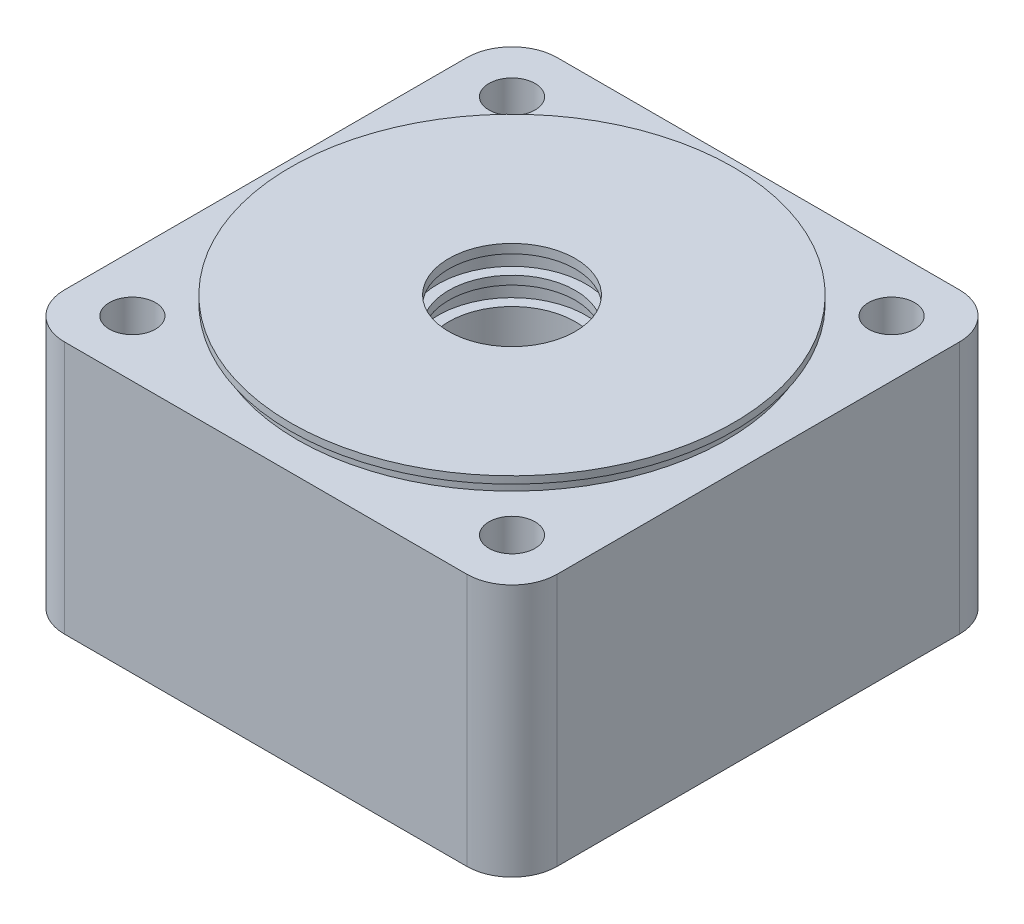
ISO-10303-21;
HEADER;
FILE_DESCRIPTION(('STEP AP214'),'2;1');
FILE_NAME('part.step','',(''),(''),'','','');
FILE_SCHEMA(('AUTOMOTIVE_DESIGN { 1 0 10303 214 1 1 1 1 }'));
ENDSEC;
DATA;
#1=APPLICATION_CONTEXT('core data for automotive mechanical design processes');
#2=APPLICATION_PROTOCOL_DEFINITION('international standard','automotive_design',2000,#1);
#3=PRODUCT_CONTEXT('',#1,'mechanical');
#4=PRODUCT('Part','Part','',(#3));
#5=PRODUCT_RELATED_PRODUCT_CATEGORY('part','',(#4));
#6=PRODUCT_DEFINITION_FORMATION('','',#4);
#7=PRODUCT_DEFINITION_CONTEXT('part definition',#1,'design');
#8=PRODUCT_DEFINITION('design','',#6,#7);
#9=PRODUCT_DEFINITION_SHAPE('','',#8);
#10=(LENGTH_UNIT() NAMED_UNIT(*) SI_UNIT(.MILLI.,.METRE.));
#11=(NAMED_UNIT(*) PLANE_ANGLE_UNIT() SI_UNIT($,.RADIAN.));
#12=(NAMED_UNIT(*) SI_UNIT($,.STERADIAN.) SOLID_ANGLE_UNIT());
#13=UNCERTAINTY_MEASURE_WITH_UNIT(LENGTH_MEASURE(1.E-05),#10,'distance_accuracy_value','');
#14=(GEOMETRIC_REPRESENTATION_CONTEXT(3) GLOBAL_UNCERTAINTY_ASSIGNED_CONTEXT((#13)) GLOBAL_UNIT_ASSIGNED_CONTEXT((#10,
#11,#12)) REPRESENTATION_CONTEXT('',''));
#15=CARTESIAN_POINT('',(0.,0.,0.));
#16=DIRECTION('',(0.,0.,1.));
#17=DIRECTION('',(1.,0.,0.));
#18=AXIS2_PLACEMENT_3D('',#15,#16,#17);
#19=CARTESIAN_POINT('',(0.,60.,0.));
#20=DIRECTION('',(0.,-1.,0.));
#21=DIRECTION('',(0.,0.,-1.));
#22=AXIS2_PLACEMENT_3D('',#19,#20,#21);
#23=CYLINDRICAL_SURFACE('',#22,14.);
#24=CARTESIAN_POINT('',(0.,53.9,0.));
#25=DIRECTION('',(0.,-1.,0.));
#26=DIRECTION('',(0.,0.,-1.));
#27=AXIS2_PLACEMENT_3D('',#24,#25,#26);
#28=CIRCLE('',#27,14.);
#29=CARTESIAN_POINT('',(0.,53.9,-14.));
#30=VERTEX_POINT('',#29);
#31=EDGE_CURVE('E391',#30,#30,#28,.T.);
#32=ORIENTED_EDGE('',*,*,#31,.F.);
#33=EDGE_LOOP('',(#32));
#34=FACE_BOUND('',#33,.T.);
#35=CARTESIAN_POINT('',(0.,52.,0.));
#36=DIRECTION('',(0.,-1.,0.));
#37=DIRECTION('',(0.,0.,-1.));
#38=AXIS2_PLACEMENT_3D('',#35,#36,#37);
#39=CIRCLE('',#38,14.);
#40=CARTESIAN_POINT('',(0.,52.,-14.));
#41=VERTEX_POINT('',#40);
#42=EDGE_CURVE('E19',#41,#41,#39,.F.);
#43=ORIENTED_EDGE('',*,*,#42,.F.);
#44=EDGE_LOOP('',(#43));
#45=FACE_BOUND('',#44,.T.);
#46=ADVANCED_FACE('F16',(#34,#45),#23,.F.);
#47=CARTESIAN_POINT('',(0.,52.,-14.));
#48=DIRECTION('',(0.,-1.,0.));
#49=DIRECTION('',(0.,0.,-1.));
#50=AXIS2_PLACEMENT_3D('',#47,#48,#49);
#51=PLANE('',#50);
#52=CARTESIAN_POINT('',(0.,52.,0.));
#53=DIRECTION('',(0.,1.,0.));
#54=DIRECTION('',(0.,0.,1.));
#55=AXIS2_PLACEMENT_3D('',#52,#53,#54);
#56=CIRCLE('',#55,16.4);
#57=CARTESIAN_POINT('',(0.,52.,16.4));
#58=VERTEX_POINT('',#57);
#59=EDGE_CURVE('E389',#58,#58,#56,.F.);
#60=ORIENTED_EDGE('',*,*,#59,.T.);
#61=EDGE_LOOP('',(#60));
#62=FACE_BOUND('',#61,.T.);
#63=ORIENTED_EDGE('',*,*,#42,.T.);
#64=EDGE_LOOP('',(#63));
#65=FACE_BOUND('',#64,.T.);
#66=ADVANCED_FACE('F398',(#62,#65),#51,.T.);
#67=CARTESIAN_POINT('',(0.,53.9,-14.));
#68=DIRECTION('',(0.,1.,0.));
#69=DIRECTION('',(0.,0.,1.));
#70=AXIS2_PLACEMENT_3D('',#67,#68,#69);
#71=PLANE('',#70);
#72=ORIENTED_EDGE('',*,*,#31,.T.);
#73=EDGE_LOOP('',(#72));
#74=FACE_BOUND('',#73,.T.);
#75=CARTESIAN_POINT('',(0.,53.9,0.));
#76=DIRECTION('',(0.,1.,0.));
#77=DIRECTION('',(0.,0.,1.));
#78=AXIS2_PLACEMENT_3D('',#75,#76,#77);
#79=CIRCLE('',#78,16.4);
#80=CARTESIAN_POINT('',(0.,53.9,16.4));
#81=VERTEX_POINT('',#80);
#82=EDGE_CURVE('E386',#81,#81,#79,.T.);
#83=ORIENTED_EDGE('',*,*,#82,.T.);
#84=EDGE_LOOP('',(#83));
#85=FACE_BOUND('',#84,.T.);
#86=ADVANCED_FACE('F406',(#74,#85),#71,.T.);
#87=CARTESIAN_POINT('',(0.,33.,0.));
#88=DIRECTION('',(0.,1.,0.));
#89=DIRECTION('',(0.,0.,1.));
#90=AXIS2_PLACEMENT_3D('',#87,#88,#89);
#91=CYLINDRICAL_SURFACE('',#90,16.4);
#92=CARTESIAN_POINT('',(0.,31.,0.));
#93=DIRECTION('',(0.,1.,0.));
#94=DIRECTION('',(0.,0.,1.));
#95=AXIS2_PLACEMENT_3D('',#92,#93,#94);
#96=CIRCLE('',#95,16.4);
#97=CARTESIAN_POINT('',(0.,31.,16.4));
#98=VERTEX_POINT('',#97);
#99=EDGE_CURVE('E380',#98,#98,#96,.F.);
#100=ORIENTED_EDGE('',*,*,#99,.F.);
#101=EDGE_LOOP('',(#100));
#102=FACE_BOUND('',#101,.T.);
#103=CARTESIAN_POINT('',(0.,26.9,0.));
#104=DIRECTION('',(0.,1.,0.));
#105=DIRECTION('',(0.,0.,1.));
#106=AXIS2_PLACEMENT_3D('',#103,#104,#105);
#107=CIRCLE('',#106,16.4);
#108=CARTESIAN_POINT('',(0.,26.9,16.4));
#109=VERTEX_POINT('',#108);
#110=EDGE_CURVE('E383',#109,#109,#107,.T.);
#111=ORIENTED_EDGE('',*,*,#110,.F.);
#112=EDGE_LOOP('',(#111));
#113=FACE_BOUND('',#112,.T.);
#114=ADVANCED_FACE('F412',(#102,#113),#91,.F.);
#115=CARTESIAN_POINT('',(0.,54.,0.));
#116=DIRECTION('',(0.,1.,0.));
#117=DIRECTION('',(0.,0.,1.));
#118=AXIS2_PLACEMENT_3D('',#115,#116,#117);
#119=CYLINDRICAL_SURFACE('',#118,16.4);
#120=ORIENTED_EDGE('',*,*,#59,.F.);
#121=EDGE_LOOP('',(#120));
#122=FACE_BOUND('',#121,.T.);
#123=CARTESIAN_POINT('',(0.,47.9,0.));
#124=DIRECTION('',(0.,1.,0.));
#125=DIRECTION('',(0.,0.,1.));
#126=AXIS2_PLACEMENT_3D('',#123,#124,#125);
#127=CIRCLE('',#126,16.4);
#128=CARTESIAN_POINT('',(0.,47.9,16.4));
#129=VERTEX_POINT('',#128);
#130=EDGE_CURVE('E377',#129,#129,#127,.T.);
#131=ORIENTED_EDGE('',*,*,#130,.F.);
#132=EDGE_LOOP('',(#131));
#133=FACE_BOUND('',#132,.T.);
#134=ADVANCED_FACE('F417',(#122,#133),#119,.F.);
#135=CARTESIAN_POINT('',(0.,60.,0.));
#136=DIRECTION('',(0.,1.,0.));
#137=DIRECTION('',(0.,0.,1.));
#138=AXIS2_PLACEMENT_3D('',#135,#136,#137);
#139=CYLINDRICAL_SURFACE('',#138,16.4);
#140=CARTESIAN_POINT('',(0.,58.,0.));
#141=DIRECTION('',(0.,1.,0.));
#142=DIRECTION('',(0.,0.,1.));
#143=AXIS2_PLACEMENT_3D('',#140,#141,#142);
#144=CIRCLE('',#143,16.4);
#145=CARTESIAN_POINT('',(0.,58.,16.4));
#146=VERTEX_POINT('',#145);
#147=EDGE_CURVE('E374',#146,#146,#144,.F.);
#148=ORIENTED_EDGE('',*,*,#147,.F.);
#149=EDGE_LOOP('',(#148));
#150=FACE_BOUND('',#149,.T.);
#151=ORIENTED_EDGE('',*,*,#82,.F.);
#152=EDGE_LOOP('',(#151));
#153=FACE_BOUND('',#152,.T.);
#154=ADVANCED_FACE('F421',(#150,#153),#139,.F.);
#155=CARTESIAN_POINT('',(0.,26.9,-14.));
#156=DIRECTION('',(0.,1.,0.));
#157=DIRECTION('',(0.,0.,1.));
#158=AXIS2_PLACEMENT_3D('',#155,#156,#157);
#159=PLANE('',#158);
#160=CARTESIAN_POINT('',(0.,26.9,0.));
#161=DIRECTION('',(0.,-1.,0.));
#162=DIRECTION('',(0.,0.,-1.));
#163=AXIS2_PLACEMENT_3D('',#160,#161,#162);
#164=CIRCLE('',#163,14.);
#165=CARTESIAN_POINT('',(0.,26.9,-14.));
#166=VERTEX_POINT('',#165);
#167=EDGE_CURVE('E371',#166,#166,#164,.T.);
#168=ORIENTED_EDGE('',*,*,#167,.T.);
#169=EDGE_LOOP('',(#168));
#170=FACE_BOUND('',#169,.T.);
#171=ORIENTED_EDGE('',*,*,#110,.T.);
#172=EDGE_LOOP('',(#171));
#173=FACE_BOUND('',#172,.T.);
#174=ADVANCED_FACE('F425',(#170,#173),#159,.T.);
#175=CARTESIAN_POINT('',(0.,31.,-14.));
#176=DIRECTION('',(0.,-1.,0.));
#177=DIRECTION('',(0.,0.,-1.));
#178=AXIS2_PLACEMENT_3D('',#175,#176,#177);
#179=PLANE('',#178);
#180=ORIENTED_EDGE('',*,*,#99,.T.);
#181=EDGE_LOOP('',(#180));
#182=FACE_BOUND('',#181,.T.);
#183=CARTESIAN_POINT('',(0.,31.,0.));
#184=DIRECTION('',(0.,-1.,0.));
#185=DIRECTION('',(0.,0.,-1.));
#186=AXIS2_PLACEMENT_3D('',#183,#184,#185);
#187=CIRCLE('',#186,14.);
#188=CARTESIAN_POINT('',(0.,31.,-14.));
#189=VERTEX_POINT('',#188);
#190=EDGE_CURVE('E366',#189,#189,#187,.F.);
#191=ORIENTED_EDGE('',*,*,#190,.T.);
#192=EDGE_LOOP('',(#191));
#193=FACE_BOUND('',#192,.T.);
#194=ADVANCED_FACE('F429',(#182,#193),#179,.T.);
#195=CARTESIAN_POINT('',(0.,47.9,-14.));
#196=DIRECTION('',(0.,1.,0.));
#197=DIRECTION('',(0.,0.,1.));
#198=AXIS2_PLACEMENT_3D('',#195,#196,#197);
#199=PLANE('',#198);
#200=CARTESIAN_POINT('',(0.,47.9,0.));
#201=DIRECTION('',(0.,-1.,0.));
#202=DIRECTION('',(0.,0.,-1.));
#203=AXIS2_PLACEMENT_3D('',#200,#201,#202);
#204=CIRCLE('',#203,14.);
#205=CARTESIAN_POINT('',(0.,47.9,-14.));
#206=VERTEX_POINT('',#205);
#207=EDGE_CURVE('E362',#206,#206,#204,.T.);
#208=ORIENTED_EDGE('',*,*,#207,.T.);
#209=EDGE_LOOP('',(#208));
#210=FACE_BOUND('',#209,.T.);
#211=ORIENTED_EDGE('',*,*,#130,.T.);
#212=EDGE_LOOP('',(#211));
#213=FACE_BOUND('',#212,.T.);
#214=ADVANCED_FACE('F433',(#210,#213),#199,.T.);
#215=CARTESIAN_POINT('',(0.,58.,-14.));
#216=DIRECTION('',(0.,-1.,0.));
#217=DIRECTION('',(0.,0.,-1.));
#218=AXIS2_PLACEMENT_3D('',#215,#216,#217);
#219=PLANE('',#218);
#220=ORIENTED_EDGE('',*,*,#147,.T.);
#221=EDGE_LOOP('',(#220));
#222=FACE_BOUND('',#221,.T.);
#223=CARTESIAN_POINT('',(0.,58.,0.));
#224=DIRECTION('',(0.,-1.,0.));
#225=DIRECTION('',(0.,0.,-1.));
#226=AXIS2_PLACEMENT_3D('',#223,#224,#225);
#227=CIRCLE('',#226,14.);
#228=CARTESIAN_POINT('',(0.,58.,-14.));
#229=VERTEX_POINT('',#228);
#230=EDGE_CURVE('E360',#229,#229,#227,.F.);
#231=ORIENTED_EDGE('',*,*,#230,.T.);
#232=EDGE_LOOP('',(#231));
#233=FACE_BOUND('',#232,.T.);
#234=ADVANCED_FACE('F437',(#222,#233),#219,.T.);
#235=CARTESIAN_POINT('',(0.,60.,0.));
#236=DIRECTION('',(0.,-1.,0.));
#237=DIRECTION('',(0.,0.,-1.));
#238=AXIS2_PLACEMENT_3D('',#235,#236,#237);
#239=CYLINDRICAL_SURFACE('',#238,14.);
#240=CARTESIAN_POINT('',(0.,25.,0.));
#241=DIRECTION('',(0.,-1.,0.));
#242=DIRECTION('',(0.,0.,-1.));
#243=AXIS2_PLACEMENT_3D('',#240,#241,#242);
#244=CIRCLE('',#243,14.);
#245=CARTESIAN_POINT('',(0.,25.,-14.));
#246=VERTEX_POINT('',#245);
#247=EDGE_CURVE('E217',#246,#246,#244,.F.);
#248=ORIENTED_EDGE('',*,*,#247,.F.);
#249=EDGE_LOOP('',(#248));
#250=FACE_BOUND('',#249,.T.);
#251=ORIENTED_EDGE('',*,*,#167,.F.);
#252=EDGE_LOOP('',(#251));
#253=FACE_BOUND('',#252,.T.);
#254=ADVANCED_FACE('F242',(#250,#253),#239,.F.);
#255=CARTESIAN_POINT('',(0.,60.,0.));
#256=DIRECTION('',(0.,-1.,0.));
#257=DIRECTION('',(0.,0.,-1.));
#258=AXIS2_PLACEMENT_3D('',#255,#256,#257);
#259=CYLINDRICAL_SURFACE('',#258,14.);
#260=CARTESIAN_POINT('',(-3.4,36.,-13.580868897092));
#261=CARTESIAN_POINT('',(-3.39999176690634,36.1878710251142,-13.5808741983816));
#262=CARTESIAN_POINT('',(-3.38437041851387,36.3758509131405,-13.5848113235658));
#263=CARTESIAN_POINT('',(-3.32237159703101,36.7464733044088,-13.6001038216367));
#264=CARTESIAN_POINT('',(-3.27596364790272,36.9291103314498,-13.611466545049));
#265=CARTESIAN_POINT('',(-3.15397249499499,37.2835625501736,-13.6402475529358));
#266=CARTESIAN_POINT('',(-3.07842953737456,37.4553922915289,-13.6576574807149));
#267=CARTESIAN_POINT('',(-2.90042995955958,37.7839346623355,-13.6965604596014));
#268=CARTESIAN_POINT('',(-2.79797543610261,37.9406484682017,-13.7180531925727));
#269=CARTESIAN_POINT('',(-2.56679209708901,38.2377820227633,-13.7631999225796));
#270=CARTESIAN_POINT('',(-2.43760855663287,38.3778430381217,-13.7868867724418));
#271=CARTESIAN_POINT('',(-2.15757790837842,38.6345676945956,-13.8334727713616));
#272=CARTESIAN_POINT('',(-2.00672433539892,38.7512243281104,-13.8563716828041));
#273=CARTESIAN_POINT('',(-1.68516005526013,38.9592919708937,-13.8991681929135));
#274=CARTESIAN_POINT('',(-1.51420835804245,39.0503401624576,-13.9190210060563));
#275=CARTESIAN_POINT('',(-1.15897541568253,39.202186420524,-13.9530813336676));
#276=CARTESIAN_POINT('',(-0.974709766842558,39.2630192445309,-13.967295330801));
#277=CARTESIAN_POINT('',(-0.657928545397314,39.3383596969392,-13.9851280576852));
#278=CARTESIAN_POINT('',(-0.527494804628111,39.3614357811047,-13.990676401206));
#279=CARTESIAN_POINT('',(-0.264725303804771,39.3922585634668,-13.9981139853122));
#280=CARTESIAN_POINT('',(-0.132389603837242,39.4000057448659,-14.0000033412373));
#281=CARTESIAN_POINT('',(0.187963072600322,39.3999918435995,-13.9999952562043));
#282=CARTESIAN_POINT('',(0.3760348020856,39.3843557031275,-13.9961753025002));
#283=CARTESIAN_POINT('',(0.746848209039791,39.3222927782297,-13.9813001720235));
#284=CARTESIAN_POINT('',(0.929584482907417,39.2758358365471,-13.970237909002));
#285=CARTESIAN_POINT('',(1.28424693433664,39.1537015132288,-13.9421061430734));
#286=CARTESIAN_POINT('',(1.45618682851569,39.0780621180874,-13.9250444521062));
#287=CARTESIAN_POINT('',(1.78491557353491,38.8998351056365,-13.8867382166481));
#288=CARTESIAN_POINT('',(1.94170572806799,38.7972498099546,-13.8654940325555));
#289=CARTESIAN_POINT('',(2.23876093287464,38.5659310638321,-13.8206704947661));
#290=CARTESIAN_POINT('',(2.37868963355031,38.4367723157477,-13.7970568436261));
#291=CARTESIAN_POINT('',(2.63515665019909,38.1568477649133,-13.750381249066));
#292=CARTESIAN_POINT('',(2.75168755256008,38.0060751396423,-13.7273194825433));
#293=CARTESIAN_POINT('',(2.95961729108206,37.6845893751818,-13.6840102957965));
#294=CARTESIAN_POINT('',(3.0506318904581,37.5136213590292,-13.6638079609772));
#295=CARTESIAN_POINT('',(3.20241137526101,37.1583535809414,-13.6290381671202));
#296=CARTESIAN_POINT('',(3.26321146176636,36.9740696207876,-13.6144641553029));
#297=CARTESIAN_POINT('',(3.3384640981828,36.6573741035797,-13.5961612379143));
#298=CARTESIAN_POINT('',(3.36150079991684,36.5270518859918,-13.5904586071487));
#299=CARTESIAN_POINT('',(3.39227138022437,36.264504390505,-13.582810636488));
#300=CARTESIAN_POINT('',(3.40000579688579,36.1322791796874,-13.5808651644768));
#301=CARTESIAN_POINT('',(3.39999176690633,35.8121289748858,-13.5808741983816));
#302=CARTESIAN_POINT('',(3.38437041851387,35.6241490868595,-13.5848113235658));
#303=CARTESIAN_POINT('',(3.32237159703101,35.2535266955912,-13.6001038216367));
#304=CARTESIAN_POINT('',(3.27596364790272,35.0708896685502,-13.611466545049));
#305=CARTESIAN_POINT('',(3.15397249499499,34.7164374498264,-13.6402475529358));
#306=CARTESIAN_POINT('',(3.07842953737454,34.544607708471,-13.6576574807149));
#307=CARTESIAN_POINT('',(2.90042995955957,34.2160653376644,-13.6965604596014));
#308=CARTESIAN_POINT('',(2.79797543610261,34.0593515317983,-13.7180531925727));
#309=CARTESIAN_POINT('',(2.56679209708901,33.7622179772367,-13.7631999225796));
#310=CARTESIAN_POINT('',(2.43760855663286,33.6221569618783,-13.7868867724418));
#311=CARTESIAN_POINT('',(2.15757790837841,33.3654323054044,-13.8334727713616));
#312=CARTESIAN_POINT('',(2.00672433539892,33.2487756718896,-13.8563716828041));
#313=CARTESIAN_POINT('',(1.68516005526013,33.0407080291063,-13.8991681929135));
#314=CARTESIAN_POINT('',(1.51420835804245,32.9496598375424,-13.9190210060563));
#315=CARTESIAN_POINT('',(1.15897541568253,32.797813579476,-13.9530813336676));
#316=CARTESIAN_POINT('',(0.974709766842557,32.7369807554691,-13.967295330801));
#317=CARTESIAN_POINT('',(0.657928545397314,32.6616403030608,-13.9851280576852));
#318=CARTESIAN_POINT('',(0.527494804628111,32.6385642188953,-13.990676401206));
#319=CARTESIAN_POINT('',(0.26472530380477,32.6077414365332,-13.9981139853122));
#320=CARTESIAN_POINT('',(0.13238960383724,32.5999942551341,-14.0000033412373));
#321=CARTESIAN_POINT('',(-0.187963072600324,32.6000081564005,-13.9999952562043));
#322=CARTESIAN_POINT('',(-0.376034802085602,32.6156442968725,-13.9961753025002));
#323=CARTESIAN_POINT('',(-0.746848209039793,32.6777072217703,-13.9813001720235));
#324=CARTESIAN_POINT('',(-0.929584482907417,32.7241641634529,-13.970237909002));
#325=CARTESIAN_POINT('',(-1.28424693433664,32.8462984867712,-13.9421061430734));
#326=CARTESIAN_POINT('',(-1.45618682851569,32.9219378819126,-13.9250444521062));
#327=CARTESIAN_POINT('',(-1.78491557353491,33.1001648943635,-13.8867382166481));
#328=CARTESIAN_POINT('',(-1.94170572806799,33.2027501900454,-13.8654940325555));
#329=CARTESIAN_POINT('',(-2.23876093287463,33.4340689361679,-13.8206704947661));
#330=CARTESIAN_POINT('',(-2.3786896335503,33.5632276842523,-13.7970568436261));
#331=CARTESIAN_POINT('',(-2.63515665019908,33.8431522350866,-13.750381249066));
#332=CARTESIAN_POINT('',(-2.75168755256008,33.9939248603577,-13.7273194825433));
#333=CARTESIAN_POINT('',(-2.95961729108206,34.3154106248181,-13.6840102957965));
#334=CARTESIAN_POINT('',(-3.05063189045809,34.4863786409708,-13.6638079609772));
#335=CARTESIAN_POINT('',(-3.202411375261,34.8416464190586,-13.6290381671202));
#336=CARTESIAN_POINT('',(-3.26321146176636,35.0259303792123,-13.6144641553029));
#337=CARTESIAN_POINT('',(-3.33846409818281,35.3426258964203,-13.5961612379143));
#338=CARTESIAN_POINT('',(-3.36150079991684,35.4729481140082,-13.5904586071487));
#339=CARTESIAN_POINT('',(-3.39227138022437,35.735495609495,-13.582810636488));
#340=CARTESIAN_POINT('',(-3.40000579688579,35.8677208203126,-13.5808651644768));
#341=CARTESIAN_POINT('',(-3.4,36.,-13.580868897092));
#342=B_SPLINE_CURVE_WITH_KNOTS('',3,(#260,#261,#262,#263,#264,#265,#266,#267,#268,#269,#270,
#271,#272,#273,#274,#275,#276,#277,#278,#279,#280,#281,#282,#283,#284,#285,#286,#287,#288,#289,
#290,#291,#292,#293,#294,#295,#296,#297,#298,#299,#300,#301,#302,#303,#304,#305,#306,#307,#308,
#309,#310,#311,#312,#313,#314,#315,#316,#317,#318,#319,#320,#321,#322,#323,#324,#325,#326,#327,
#328,#329,#330,#331,#332,#333,#334,#335,#336,#337,#338,#339,#340,#341),.UNSPECIFIED.,.T.,.F.,(4,
2,2,2,2,2,2,2,2,2,2,2,2,2,2,2,2,2,2,2,2,2,2,2,2,2,2,2,2,2,2,2,2,2,2,2,2,2,2,2,4),(0.,
0.563122471354607,1.12680321810598,1.68970808736769,2.25256911251093,2.82593615361488,
3.39947461350001,3.98077081008284,4.56139676923798,4.95823290428446,5.35505652994007,
5.91845566247562,6.48240687932098,7.045626470122,7.60879755048246,8.18180220069456,
8.75498812239748,9.33639111565171,9.91711515453649,10.3136212043876,10.7101133112947,
11.2732357826493,11.8369165294007,12.3998213986624,12.9626824238057,13.5360494649096,
14.1095879247947,14.6908841213775,15.2715100805327,15.6683462155792,16.0651698412348,
16.6285689737703,17.1925201906157,17.7557397814167,18.3189108617772,18.8919155119892,
19.4651014336921,20.0465044269464,20.6272284658311,21.0237345156823,21.4202266225894),.UNSPECIFIED.);
#343=CARTESIAN_POINT('',(-3.4,36.,-13.580868897092));
#344=VERTEX_POINT('',#343);
#345=EDGE_CURVE('E209',#344,#344,#342,.T.);
#346=ORIENTED_EDGE('',*,*,#345,.T.);
#347=EDGE_LOOP('',(#346));
#348=FACE_BOUND('',#347,.T.);
#349=ORIENTED_EDGE('',*,*,#207,.F.);
#350=EDGE_LOOP('',(#349));
#351=FACE_BOUND('',#350,.T.);
#352=ORIENTED_EDGE('',*,*,#190,.F.);
#353=EDGE_LOOP('',(#352));
#354=FACE_BOUND('',#353,.T.);
#355=ADVANCED_FACE('F219',(#348,#351,#354),#259,.F.);
#356=CARTESIAN_POINT('',(0.,60.,0.));
#357=DIRECTION('',(0.,-1.,0.));
#358=DIRECTION('',(0.,0.,-1.));
#359=AXIS2_PLACEMENT_3D('',#356,#357,#358);
#360=CYLINDRICAL_SURFACE('',#359,14.);
#361=CARTESIAN_POINT('',(0.,60.,0.));
#362=DIRECTION('',(0.,-1.,0.));
#363=DIRECTION('',(0.,0.,-1.));
#364=AXIS2_PLACEMENT_3D('',#361,#362,#363);
#365=CIRCLE('',#364,14.);
#366=CARTESIAN_POINT('',(0.,60.,-14.));
#367=VERTEX_POINT('',#366);
#368=EDGE_CURVE('E206',#367,#367,#365,.F.);
#369=ORIENTED_EDGE('',*,*,#368,.T.);
#370=EDGE_LOOP('',(#369));
#371=FACE_BOUND('',#370,.T.);
#372=ORIENTED_EDGE('',*,*,#230,.F.);
#373=EDGE_LOOP('',(#372));
#374=FACE_BOUND('',#373,.T.);
#375=ADVANCED_FACE('F233',(#371,#374),#360,.F.);
#376=CARTESIAN_POINT('',(0.,25.,0.));
#377=DIRECTION('',(0.,-1.,0.));
#378=DIRECTION('',(0.,0.,-1.));
#379=AXIS2_PLACEMENT_3D('',#376,#377,#378);
#380=PLANE('',#379);
#381=CARTESIAN_POINT('',(0.,25.,0.));
#382=DIRECTION('',(0.,-1.,0.));
#383=DIRECTION('',(0.,0.,-1.));
#384=AXIS2_PLACEMENT_3D('',#381,#382,#383);
#385=CIRCLE('',#384,35.);
#386=CARTESIAN_POINT('',(0.,25.,-35.));
#387=VERTEX_POINT('',#386);
#388=EDGE_CURVE('E131',#387,#387,#385,.T.);
#389=ORIENTED_EDGE('',*,*,#388,.T.);
#390=EDGE_LOOP('',(#389));
#391=FACE_BOUND('',#390,.T.);
#392=ORIENTED_EDGE('',*,*,#247,.T.);
#393=EDGE_LOOP('',(#392));
#394=FACE_BOUND('',#393,.T.);
#395=ADVANCED_FACE('F229',(#391,#394),#380,.T.);
#396=CARTESIAN_POINT('',(0.,36.,-54.5));
#397=DIRECTION('',(0.,0.,-1.));
#398=DIRECTION('',(-1.,0.,0.));
#399=AXIS2_PLACEMENT_3D('',#396,#397,#398);
#400=CYLINDRICAL_SURFACE('',#399,3.4);
#401=ORIENTED_EDGE('',*,*,#345,.F.);
#402=EDGE_LOOP('',(#401));
#403=FACE_BOUND('',#402,.T.);
#404=CARTESIAN_POINT('',(0.,36.,-35.6383217929306));
#405=DIRECTION('',(0.,0.,-1.));
#406=DIRECTION('',(-1.,0.,0.));
#407=AXIS2_PLACEMENT_3D('',#404,#405,#406);
#408=CIRCLE('',#407,3.39999999999918);
#409=CARTESIAN_POINT('',(-3.39999999999918,36.,-35.6383217929306));
#410=VERTEX_POINT('',#409);
#411=EDGE_CURVE('E128',#410,#410,#408,.T.);
#412=ORIENTED_EDGE('',*,*,#411,.T.);
#413=EDGE_LOOP('',(#412));
#414=FACE_BOUND('',#413,.T.);
#415=ADVANCED_FACE('F223',(#403,#414),#400,.F.);
#416=CARTESIAN_POINT('',(0.,60.,0.));
#417=DIRECTION('',(0.,-1.,0.));
#418=DIRECTION('',(0.,0.,-1.));
#419=AXIS2_PLACEMENT_3D('',#416,#417,#418);
#420=PLANE('',#419);
#421=CARTESIAN_POINT('',(0.,60.,0.));
#422=DIRECTION('',(0.,1.,0.));
#423=DIRECTION('',(0.,0.,1.));
#424=AXIS2_PLACEMENT_3D('',#421,#422,#423);
#425=CIRCLE('',#424,49.);
#426=CARTESIAN_POINT('',(0.,60.,49.));
#427=VERTEX_POINT('',#426);
#428=EDGE_CURVE('E130',#427,#427,#425,.F.);
#429=ORIENTED_EDGE('',*,*,#428,.F.);
#430=EDGE_LOOP('',(#429));
#431=FACE_BOUND('',#430,.T.);
#432=ORIENTED_EDGE('',*,*,#368,.F.);
#433=EDGE_LOOP('',(#432));
#434=FACE_BOUND('',#433,.T.);
#435=ADVANCED_FACE('F228',(#431,#434),#420,.F.);
#436=CARTESIAN_POINT('',(0.,25.,0.));
#437=DIRECTION('',(0.,-1.,0.));
#438=DIRECTION('',(0.,0.,-1.));
#439=AXIS2_PLACEMENT_3D('',#436,#437,#438);
#440=CYLINDRICAL_SURFACE('',#439,35.);
#441=ORIENTED_EDGE('',*,*,#388,.F.);
#442=EDGE_LOOP('',(#441));
#443=FACE_BOUND('',#442,.T.);
#444=CARTESIAN_POINT('',(0.,11.,0.));
#445=DIRECTION('',(0.,-1.,0.));
#446=DIRECTION('',(0.,0.,-1.));
#447=AXIS2_PLACEMENT_3D('',#444,#445,#446);
#448=CIRCLE('',#447,35.);
#449=CARTESIAN_POINT('',(0.,11.,-35.));
#450=VERTEX_POINT('',#449);
#451=EDGE_CURVE('E127',#450,#450,#448,.F.);
#452=ORIENTED_EDGE('',*,*,#451,.F.);
#453=EDGE_LOOP('',(#452));
#454=FACE_BOUND('',#453,.T.);
#455=ADVANCED_FACE('F343',(#443,#454),#440,.F.);
#456=CARTESIAN_POINT('',(0.,36.,-36.8100000000595));
#457=DIRECTION('',(0.,0.,-1.));
#458=DIRECTION('',(-1.,0.,0.));
#459=AXIS2_PLACEMENT_3D('',#456,#457,#458);
#460=CONICAL_SURFACE('',#459,5.35000000007813,1.02974425868503);
#461=ORIENTED_EDGE('',*,*,#411,.F.);
#462=EDGE_LOOP('',(#461));
#463=FACE_BOUND('',#462,.T.);
#464=CARTESIAN_POINT('',(0.,36.,-36.81));
#465=DIRECTION('',(0.,0.,-1.));
#466=DIRECTION('',(-1.,0.,0.));
#467=AXIS2_PLACEMENT_3D('',#464,#465,#466);
#468=CIRCLE('',#467,5.35);
#469=CARTESIAN_POINT('',(-5.35,36.,-36.81));
#470=VERTEX_POINT('',#469);
#471=EDGE_CURVE('E123',#470,#470,#468,.T.);
#472=ORIENTED_EDGE('',*,*,#471,.T.);
#473=EDGE_LOOP('',(#472));
#474=FACE_BOUND('',#473,.T.);
#475=ADVANCED_FACE('F340',(#463,#474),#460,.F.);
#476=CARTESIAN_POINT('',(0.,56.,0.));
#477=DIRECTION('',(0.,1.,0.));
#478=DIRECTION('',(0.,0.,1.));
#479=AXIS2_PLACEMENT_3D('',#476,#477,#478);
#480=CYLINDRICAL_SURFACE('',#479,49.);
#481=CARTESIAN_POINT('',(0.,58.4,0.));
#482=DIRECTION('',(0.,1.,0.));
#483=DIRECTION('',(0.,0.,1.));
#484=AXIS2_PLACEMENT_3D('',#481,#482,#483);
#485=CIRCLE('',#484,49.);
#486=CARTESIAN_POINT('',(0.,58.4,49.));
#487=VERTEX_POINT('',#486);
#488=EDGE_CURVE('E126',#487,#487,#485,.F.);
#489=ORIENTED_EDGE('',*,*,#488,.F.);
#490=EDGE_LOOP('',(#489));
#491=FACE_BOUND('',#490,.T.);
#492=ORIENTED_EDGE('',*,*,#428,.T.);
#493=EDGE_LOOP('',(#492));
#494=FACE_BOUND('',#493,.T.);
#495=ADVANCED_FACE('F336',(#491,#494),#480,.T.);
#496=CARTESIAN_POINT('',(0.,11.,-35.));
#497=DIRECTION('',(0.,-1.,0.));
#498=DIRECTION('',(0.,0.,-1.));
#499=AXIS2_PLACEMENT_3D('',#496,#497,#498);
#500=PLANE('',#499);
#501=CARTESIAN_POINT('',(0.,11.,0.));
#502=DIRECTION('',(0.,1.,0.));
#503=DIRECTION('',(0.,0.,1.));
#504=AXIS2_PLACEMENT_3D('',#501,#502,#503);
#505=CIRCLE('',#504,40.);
#506=CARTESIAN_POINT('',(0.,11.,40.));
#507=VERTEX_POINT('',#506);
#508=EDGE_CURVE('E195',#507,#507,#505,.F.);
#509=ORIENTED_EDGE('',*,*,#508,.T.);
#510=EDGE_LOOP('',(#509));
#511=FACE_BOUND('',#510,.T.);
#512=ORIENTED_EDGE('',*,*,#451,.T.);
#513=EDGE_LOOP('',(#512));
#514=FACE_BOUND('',#513,.T.);
#515=ADVANCED_FACE('F332',(#511,#514),#500,.T.);
#516=CARTESIAN_POINT('',(0.,36.,-54.5));
#517=DIRECTION('',(0.,0.,-1.));
#518=DIRECTION('',(-1.,0.,0.));
#519=AXIS2_PLACEMENT_3D('',#516,#517,#518);
#520=CYLINDRICAL_SURFACE('',#519,5.35);
#521=ORIENTED_EDGE('',*,*,#471,.F.);
#522=EDGE_LOOP('',(#521));
#523=FACE_BOUND('',#522,.T.);
#524=CARTESIAN_POINT('',(0.,36.,-43.5));
#525=DIRECTION('',(0.,0.,-1.));
#526=DIRECTION('',(-1.,0.,0.));
#527=AXIS2_PLACEMENT_3D('',#524,#525,#526);
#528=CIRCLE('',#527,5.35);
#529=CARTESIAN_POINT('',(-5.35,36.,-43.5));
#530=VERTEX_POINT('',#529);
#531=EDGE_CURVE('E192',#530,#530,#528,.T.);
#532=ORIENTED_EDGE('',*,*,#531,.T.);
#533=EDGE_LOOP('',(#532));
#534=FACE_BOUND('',#533,.T.);
#535=ADVANCED_FACE('F328',(#523,#534),#520,.F.);
#536=CARTESIAN_POINT('',(49.,58.4,0.));
#537=DIRECTION('',(0.,-1.,0.));
#538=DIRECTION('',(0.,0.,-1.));
#539=AXIS2_PLACEMENT_3D('',#536,#537,#538);
#540=PLANE('',#539);
#541=ORIENTED_EDGE('',*,*,#488,.T.);
#542=EDGE_LOOP('',(#541));
#543=FACE_BOUND('',#542,.T.);
#544=CARTESIAN_POINT('',(0.,58.4,0.));
#545=DIRECTION('',(0.,1.,0.));
#546=DIRECTION('',(0.,0.,1.));
#547=AXIS2_PLACEMENT_3D('',#544,#545,#546);
#548=CIRCLE('',#547,47.5);
#549=CARTESIAN_POINT('',(0.,58.4,47.5));
#550=VERTEX_POINT('',#549);
#551=EDGE_CURVE('E189',#550,#550,#548,.F.);
#552=ORIENTED_EDGE('',*,*,#551,.F.);
#553=EDGE_LOOP('',(#552));
#554=FACE_BOUND('',#553,.T.);
#555=ADVANCED_FACE('F324',(#543,#554),#540,.T.);
#556=CARTESIAN_POINT('',(0.,60.,0.));
#557=DIRECTION('',(0.,1.,0.));
#558=DIRECTION('',(0.,0.,1.));
#559=AXIS2_PLACEMENT_3D('',#556,#557,#558);
#560=CYLINDRICAL_SURFACE('',#559,40.);
#561=ORIENTED_EDGE('',*,*,#508,.F.);
#562=EDGE_LOOP('',(#561));
#563=FACE_BOUND('',#562,.T.);
#564=CARTESIAN_POINT('',(0.,4.,0.));
#565=DIRECTION('',(0.,1.,0.));
#566=DIRECTION('',(0.,0.,1.));
#567=AXIS2_PLACEMENT_3D('',#564,#565,#566);
#568=CIRCLE('',#567,40.);
#569=CARTESIAN_POINT('',(0.,4.,40.));
#570=VERTEX_POINT('',#569);
#571=EDGE_CURVE('E186',#570,#570,#568,.T.);
#572=ORIENTED_EDGE('',*,*,#571,.F.);
#573=EDGE_LOOP('',(#572));
#574=FACE_BOUND('',#573,.T.);
#575=ADVANCED_FACE('F320',(#563,#574),#560,.F.);
#576=CARTESIAN_POINT('',(5.35,36.,-43.5));
#577=DIRECTION('',(0.,0.,1.));
#578=DIRECTION('',(1.,0.,0.));
#579=AXIS2_PLACEMENT_3D('',#576,#577,#578);
#580=PLANE('',#579);
#581=CARTESIAN_POINT('',(0.,36.,-43.4999999999946));
#582=DIRECTION('',(0.,0.,-1.));
#583=DIRECTION('',(-1.,0.,0.));
#584=AXIS2_PLACEMENT_3D('',#581,#582,#583);
#585=CIRCLE('',#584,5.81061716828124);
#586=CARTESIAN_POINT('',(-5.81061716828124,36.,-43.4999999999946));
#587=VERTEX_POINT('',#586);
#588=EDGE_CURVE('E183',#587,#587,#585,.T.);
#589=ORIENTED_EDGE('',*,*,#588,.T.);
#590=EDGE_LOOP('',(#589));
#591=FACE_BOUND('',#590,.T.);
#592=ORIENTED_EDGE('',*,*,#531,.F.);
#593=EDGE_LOOP('',(#592));
#594=FACE_BOUND('',#593,.T.);
#595=ADVANCED_FACE('F316',(#591,#594),#580,.F.);
#596=CARTESIAN_POINT('',(0.,60.,0.));
#597=DIRECTION('',(0.,1.,0.));
#598=DIRECTION('',(0.,0.,1.));
#599=AXIS2_PLACEMENT_3D('',#596,#597,#598);
#600=CYLINDRICAL_SURFACE('',#599,47.5);
#601=CARTESIAN_POINT('',(0.,56.,0.));
#602=DIRECTION('',(0.,1.,0.));
#603=DIRECTION('',(0.,0.,1.));
#604=AXIS2_PLACEMENT_3D('',#601,#602,#603);
#605=CIRCLE('',#604,47.5);
#606=CARTESIAN_POINT('',(0.,56.,47.5));
#607=VERTEX_POINT('',#606);
#608=EDGE_CURVE('E180',#607,#607,#605,.F.);
#609=ORIENTED_EDGE('',*,*,#608,.F.);
#610=EDGE_LOOP('',(#609));
#611=FACE_BOUND('',#610,.T.);
#612=ORIENTED_EDGE('',*,*,#551,.T.);
#613=EDGE_LOOP('',(#612));
#614=FACE_BOUND('',#613,.T.);
#615=ADVANCED_FACE('F312',(#611,#614),#600,.T.);
#616=CARTESIAN_POINT('',(0.,4.,-35.));
#617=DIRECTION('',(0.,1.,0.));
#618=DIRECTION('',(0.,0.,1.));
#619=AXIS2_PLACEMENT_3D('',#616,#617,#618);
#620=PLANE('',#619);
#621=CARTESIAN_POINT('',(0.,4.,0.));
#622=DIRECTION('',(0.,-1.,0.));
#623=DIRECTION('',(0.,0.,-1.));
#624=AXIS2_PLACEMENT_3D('',#621,#622,#623);
#625=CIRCLE('',#624,35.);
#626=CARTESIAN_POINT('',(0.,4.,-35.));
#627=VERTEX_POINT('',#626);
#628=EDGE_CURVE('E177',#627,#627,#625,.T.);
#629=ORIENTED_EDGE('',*,*,#628,.T.);
#630=EDGE_LOOP('',(#629));
#631=FACE_BOUND('',#630,.T.);
#632=ORIENTED_EDGE('',*,*,#571,.T.);
#633=EDGE_LOOP('',(#632));
#634=FACE_BOUND('',#633,.T.);
#635=ADVANCED_FACE('F308',(#631,#634),#620,.T.);
#636=CARTESIAN_POINT('',(0.,36.,-54.4999999998481));
#637=DIRECTION('',(0.,0.,-1.));
#638=DIRECTION('',(-1.,0.,0.));
#639=AXIS2_PLACEMENT_3D('',#636,#637,#638);
#640=CONICAL_SURFACE('',#639,6.15399999999511,0.0312064870256583);
#641=ORIENTED_EDGE('',*,*,#588,.F.);
#642=EDGE_LOOP('',(#641));
#643=FACE_BOUND('',#642,.T.);
#644=CARTESIAN_POINT('',(0.,36.,-54.5000000000186));
#645=DIRECTION('',(0.,0.,-1.));
#646=DIRECTION('',(-1.,0.,0.));
#647=AXIS2_PLACEMENT_3D('',#644,#645,#646);
#648=CIRCLE('',#647,6.15400000000043);
#649=CARTESIAN_POINT('',(-6.15400000000043,36.,-54.5000000000186));
#650=VERTEX_POINT('',#649);
#651=EDGE_CURVE('E91',#650,#650,#648,.T.);
#652=ORIENTED_EDGE('',*,*,#651,.T.);
#653=EDGE_LOOP('',(#652));
#654=FACE_BOUND('',#653,.T.);
#655=ADVANCED_FACE('F304',(#643,#654),#640,.F.);
#656=CARTESIAN_POINT('',(0.,56.,0.));
#657=DIRECTION('',(0.,1.,0.));
#658=DIRECTION('',(0.,0.,1.));
#659=AXIS2_PLACEMENT_3D('',#656,#657,#658);
#660=PLANE('',#659);
#661=ORIENTED_EDGE('',*,*,#608,.T.);
#662=EDGE_LOOP('',(#661));
#663=FACE_BOUND('',#662,.T.);
#664=DIRECTION('',(0.,0.,1.));
#665=VECTOR('',#664,1.);
#666=CARTESIAN_POINT('',(54.5,56.,54.5));
#667=LINE('',#666,#665);
#668=CARTESIAN_POINT('',(54.5,56.,44.5));
#669=VERTEX_POINT('',#668);
#670=CARTESIAN_POINT('',(54.5,56.,-44.5));
#671=VERTEX_POINT('',#670);
#672=EDGE_CURVE('E120',#669,#671,#667,.F.);
#673=ORIENTED_EDGE('',*,*,#672,.T.);
#674=CARTESIAN_POINT('',(44.5,56.,-44.5));
#675=DIRECTION('',(0.,-1.,0.));
#676=DIRECTION('',(0.,0.,-1.));
#677=AXIS2_PLACEMENT_3D('',#674,#675,#676);
#678=CIRCLE('',#677,10.);
#679=CARTESIAN_POINT('',(44.5,56.,-54.5));
#680=VERTEX_POINT('',#679);
#681=EDGE_CURVE('E86',#680,#671,#678,.T.);
#682=ORIENTED_EDGE('',*,*,#681,.F.);
#683=DIRECTION('',(1.,0.,0.));
#684=VECTOR('',#683,1.);
#685=CARTESIAN_POINT('',(-54.5,56.,-54.5));
#686=LINE('',#685,#684);
#687=CARTESIAN_POINT('',(-44.5,56.,-54.5));
#688=VERTEX_POINT('',#687);
#689=EDGE_CURVE('E82',#680,#688,#686,.F.);
#690=ORIENTED_EDGE('',*,*,#689,.T.);
#691=CARTESIAN_POINT('',(-44.5,56.,-44.5));
#692=DIRECTION('',(0.,-1.,0.));
#693=DIRECTION('',(0.,0.,-1.));
#694=AXIS2_PLACEMENT_3D('',#691,#692,#693);
#695=CIRCLE('',#694,10.);
#696=CARTESIAN_POINT('',(-54.5,56.,-44.5));
#697=VERTEX_POINT('',#696);
#698=EDGE_CURVE('E79',#697,#688,#695,.T.);
#699=ORIENTED_EDGE('',*,*,#698,.F.);
#700=DIRECTION('',(0.,0.,-1.));
#701=VECTOR('',#700,1.);
#702=CARTESIAN_POINT('',(-54.5,56.,54.5));
#703=LINE('',#702,#701);
#704=CARTESIAN_POINT('',(-54.5,56.,44.5));
#705=VERTEX_POINT('',#704);
#706=EDGE_CURVE('E99',#697,#705,#703,.F.);
#707=ORIENTED_EDGE('',*,*,#706,.T.);
#708=CARTESIAN_POINT('',(-44.5,56.,44.5));
#709=DIRECTION('',(0.,-1.,0.));
#710=DIRECTION('',(0.,0.,-1.));
#711=AXIS2_PLACEMENT_3D('',#708,#709,#710);
#712=CIRCLE('',#711,10.);
#713=CARTESIAN_POINT('',(-44.5,56.,54.5));
#714=VERTEX_POINT('',#713);
#715=EDGE_CURVE('E116',#714,#705,#712,.T.);
#716=ORIENTED_EDGE('',*,*,#715,.F.);
#717=DIRECTION('',(-1.,0.,0.));
#718=VECTOR('',#717,1.);
#719=CARTESIAN_POINT('',(-54.5,56.,54.5));
#720=LINE('',#719,#718);
#721=CARTESIAN_POINT('',(44.5,56.,54.5));
#722=VERTEX_POINT('',#721);
#723=EDGE_CURVE('E113',#714,#722,#720,.F.);
#724=ORIENTED_EDGE('',*,*,#723,.T.);
#725=CARTESIAN_POINT('',(44.5,56.,44.5));
#726=DIRECTION('',(0.,-1.,0.));
#727=DIRECTION('',(0.,0.,-1.));
#728=AXIS2_PLACEMENT_3D('',#725,#726,#727);
#729=CIRCLE('',#728,10.);
#730=EDGE_CURVE('E161',#669,#722,#729,.T.);
#731=ORIENTED_EDGE('',*,*,#730,.F.);
#732=EDGE_LOOP('',(#673,#682,#690,#699,#707,#716,#724,#731));
#733=FACE_BOUND('',#732,.T.);
#734=CARTESIAN_POINT('',(-42.,56.,-42.));
#735=DIRECTION('',(0.,1.,0.));
#736=DIRECTION('',(0.,0.,1.));
#737=AXIS2_PLACEMENT_3D('',#734,#735,#736);
#738=CIRCLE('',#737,5.1);
#739=CARTESIAN_POINT('',(-42.,56.,-36.9));
#740=VERTEX_POINT('',#739);
#741=EDGE_CURVE('E119',#740,#740,#738,.F.);
#742=ORIENTED_EDGE('',*,*,#741,.T.);
#743=EDGE_LOOP('',(#742));
#744=FACE_BOUND('',#743,.T.);
#745=CARTESIAN_POINT('',(-42.,56.,42.));
#746=DIRECTION('',(0.,1.,0.));
#747=DIRECTION('',(0.,0.,1.));
#748=AXIS2_PLACEMENT_3D('',#745,#746,#747);
#749=CIRCLE('',#748,5.1);
#750=CARTESIAN_POINT('',(-42.,56.,47.1));
#751=VERTEX_POINT('',#750);
#752=EDGE_CURVE('E168',#751,#751,#749,.F.);
#753=ORIENTED_EDGE('',*,*,#752,.T.);
#754=EDGE_LOOP('',(#753));
#755=FACE_BOUND('',#754,.T.);
#756=CARTESIAN_POINT('',(42.,56.,-42.));
#757=DIRECTION('',(0.,1.,0.));
#758=DIRECTION('',(0.,0.,1.));
#759=AXIS2_PLACEMENT_3D('',#756,#757,#758);
#760=CIRCLE('',#759,5.1);
#761=CARTESIAN_POINT('',(42.,56.,-36.9));
#762=VERTEX_POINT('',#761);
#763=EDGE_CURVE('E171',#762,#762,#760,.F.);
#764=ORIENTED_EDGE('',*,*,#763,.T.);
#765=EDGE_LOOP('',(#764));
#766=FACE_BOUND('',#765,.T.);
#767=CARTESIAN_POINT('',(42.,56.,42.));
#768=DIRECTION('',(0.,1.,0.));
#769=DIRECTION('',(0.,0.,1.));
#770=AXIS2_PLACEMENT_3D('',#767,#768,#769);
#771=CIRCLE('',#770,5.1);
#772=CARTESIAN_POINT('',(42.,56.,47.1));
#773=VERTEX_POINT('',#772);
#774=EDGE_CURVE('E174',#773,#773,#771,.F.);
#775=ORIENTED_EDGE('',*,*,#774,.T.);
#776=EDGE_LOOP('',(#775));
#777=FACE_BOUND('',#776,.T.);
#778=ADVANCED_FACE('F83',(#663,#733,#744,#755,#766,#777),#660,.T.);
#779=CARTESIAN_POINT('',(0.,25.,0.));
#780=DIRECTION('',(0.,-1.,0.));
#781=DIRECTION('',(0.,0.,-1.));
#782=AXIS2_PLACEMENT_3D('',#779,#780,#781);
#783=CYLINDRICAL_SURFACE('',#782,35.);
#784=CARTESIAN_POINT('',(0.,0.,0.));
#785=DIRECTION('',(0.,-1.,0.));
#786=DIRECTION('',(0.,0.,-1.));
#787=AXIS2_PLACEMENT_3D('',#784,#785,#786);
#788=CIRCLE('',#787,35.);
#789=CARTESIAN_POINT('',(0.,0.,-35.));
#790=VERTEX_POINT('',#789);
#791=EDGE_CURVE('E155',#790,#790,#788,.F.);
#792=ORIENTED_EDGE('',*,*,#791,.F.);
#793=EDGE_LOOP('',(#792));
#794=FACE_BOUND('',#793,.T.);
#795=ORIENTED_EDGE('',*,*,#628,.F.);
#796=EDGE_LOOP('',(#795));
#797=FACE_BOUND('',#796,.T.);
#798=ADVANCED_FACE('F297',(#794,#797),#783,.F.);
#799=CARTESIAN_POINT('',(42.,56.,42.));
#800=DIRECTION('',(0.,1.,0.));
#801=DIRECTION('',(0.,0.,1.));
#802=AXIS2_PLACEMENT_3D('',#799,#800,#801);
#803=CYLINDRICAL_SURFACE('',#802,5.1);
#804=CARTESIAN_POINT('',(42.,0.,42.));
#805=DIRECTION('',(0.,1.,0.));
#806=DIRECTION('',(0.,0.,1.));
#807=AXIS2_PLACEMENT_3D('',#804,#805,#806);
#808=CIRCLE('',#807,5.1);
#809=CARTESIAN_POINT('',(42.,0.,47.1));
#810=VERTEX_POINT('',#809);
#811=EDGE_CURVE('E152',#810,#810,#808,.T.);
#812=ORIENTED_EDGE('',*,*,#811,.F.);
#813=EDGE_LOOP('',(#812));
#814=FACE_BOUND('',#813,.T.);
#815=ORIENTED_EDGE('',*,*,#774,.F.);
#816=EDGE_LOOP('',(#815));
#817=FACE_BOUND('',#816,.T.);
#818=ADVANCED_FACE('F293',(#814,#817),#803,.F.);
#819=CARTESIAN_POINT('',(42.,56.,-42.));
#820=DIRECTION('',(0.,1.,0.));
#821=DIRECTION('',(0.,0.,1.));
#822=AXIS2_PLACEMENT_3D('',#819,#820,#821);
#823=CYLINDRICAL_SURFACE('',#822,5.1);
#824=CARTESIAN_POINT('',(42.,0.,-42.));
#825=DIRECTION('',(0.,1.,0.));
#826=DIRECTION('',(0.,0.,1.));
#827=AXIS2_PLACEMENT_3D('',#824,#825,#826);
#828=CIRCLE('',#827,5.1);
#829=CARTESIAN_POINT('',(42.,0.,-36.9));
#830=VERTEX_POINT('',#829);
#831=EDGE_CURVE('E149',#830,#830,#828,.T.);
#832=ORIENTED_EDGE('',*,*,#831,.F.);
#833=EDGE_LOOP('',(#832));
#834=FACE_BOUND('',#833,.T.);
#835=ORIENTED_EDGE('',*,*,#763,.F.);
#836=EDGE_LOOP('',(#835));
#837=FACE_BOUND('',#836,.T.);
#838=ADVANCED_FACE('F289',(#834,#837),#823,.F.);
#839=CARTESIAN_POINT('',(-42.,56.,42.));
#840=DIRECTION('',(0.,1.,0.));
#841=DIRECTION('',(0.,0.,1.));
#842=AXIS2_PLACEMENT_3D('',#839,#840,#841);
#843=CYLINDRICAL_SURFACE('',#842,5.1);
#844=CARTESIAN_POINT('',(-42.,0.,42.));
#845=DIRECTION('',(0.,1.,0.));
#846=DIRECTION('',(0.,0.,1.));
#847=AXIS2_PLACEMENT_3D('',#844,#845,#846);
#848=CIRCLE('',#847,5.1);
#849=CARTESIAN_POINT('',(-42.,0.,47.1));
#850=VERTEX_POINT('',#849);
#851=EDGE_CURVE('E146',#850,#850,#848,.T.);
#852=ORIENTED_EDGE('',*,*,#851,.F.);
#853=EDGE_LOOP('',(#852));
#854=FACE_BOUND('',#853,.T.);
#855=ORIENTED_EDGE('',*,*,#752,.F.);
#856=EDGE_LOOP('',(#855));
#857=FACE_BOUND('',#856,.T.);
#858=ADVANCED_FACE('F285',(#854,#857),#843,.F.);
#859=CARTESIAN_POINT('',(-42.,56.,-42.));
#860=DIRECTION('',(0.,1.,0.));
#861=DIRECTION('',(0.,0.,1.));
#862=AXIS2_PLACEMENT_3D('',#859,#860,#861);
#863=CYLINDRICAL_SURFACE('',#862,5.1);
#864=CARTESIAN_POINT('',(-42.,0.,-42.));
#865=DIRECTION('',(0.,1.,0.));
#866=DIRECTION('',(0.,0.,1.));
#867=AXIS2_PLACEMENT_3D('',#864,#865,#866);
#868=CIRCLE('',#867,5.1);
#869=CARTESIAN_POINT('',(-42.,0.,-36.9));
#870=VERTEX_POINT('',#869);
#871=EDGE_CURVE('E143',#870,#870,#868,.T.);
#872=ORIENTED_EDGE('',*,*,#871,.F.);
#873=EDGE_LOOP('',(#872));
#874=FACE_BOUND('',#873,.T.);
#875=ORIENTED_EDGE('',*,*,#741,.F.);
#876=EDGE_LOOP('',(#875));
#877=FACE_BOUND('',#876,.T.);
#878=ADVANCED_FACE('F281',(#874,#877),#863,.F.);
#879=CARTESIAN_POINT('',(-54.5,60.,54.5));
#880=DIRECTION('',(1.,0.,0.));
#881=DIRECTION('',(0.,0.,-1.));
#882=AXIS2_PLACEMENT_3D('',#879,#880,#881);
#883=PLANE('',#882);
#884=DIRECTION('',(0.,-1.,0.));
#885=VECTOR('',#884,1.);
#886=CARTESIAN_POINT('',(-54.5,60.,-44.5));
#887=LINE('',#886,#885);
#888=CARTESIAN_POINT('',(-54.5,0.,-44.5));
#889=VERTEX_POINT('',#888);
#890=EDGE_CURVE('E98',#889,#697,#887,.F.);
#891=ORIENTED_EDGE('',*,*,#890,.F.);
#892=DIRECTION('',(0.,0.,-1.));
#893=VECTOR('',#892,1.);
#894=CARTESIAN_POINT('',(-54.5,0.,0.));
#895=LINE('',#894,#893);
#896=CARTESIAN_POINT('',(-54.5,0.,44.5));
#897=VERTEX_POINT('',#896);
#898=EDGE_CURVE('E142',#897,#889,#895,.T.);
#899=ORIENTED_EDGE('',*,*,#898,.F.);
#900=DIRECTION('',(0.,-1.,0.));
#901=VECTOR('',#900,1.);
#902=CARTESIAN_POINT('',(-54.5,60.,44.5));
#903=LINE('',#902,#901);
#904=EDGE_CURVE('E160',#705,#897,#903,.T.);
#905=ORIENTED_EDGE('',*,*,#904,.F.);
#906=ORIENTED_EDGE('',*,*,#706,.F.);
#907=EDGE_LOOP('',(#891,#899,#905,#906));
#908=FACE_BOUND('',#907,.T.);
#909=ADVANCED_FACE('F278',(#908),#883,.F.);
#910=CARTESIAN_POINT('',(-44.5,60.,-44.5));
#911=DIRECTION('',(0.,-1.,0.));
#912=DIRECTION('',(0.,0.,-1.));
#913=AXIS2_PLACEMENT_3D('',#910,#911,#912);
#914=CYLINDRICAL_SURFACE('',#913,10.);
#915=CARTESIAN_POINT('',(-44.5,0.,-44.5));
#916=DIRECTION('',(0.,-1.,0.));
#917=DIRECTION('',(0.,0.,-1.));
#918=AXIS2_PLACEMENT_3D('',#915,#916,#917);
#919=CIRCLE('',#918,10.);
#920=CARTESIAN_POINT('',(-44.5,0.,-54.5));
#921=VERTEX_POINT('',#920);
#922=EDGE_CURVE('E140',#889,#921,#919,.T.);
#923=ORIENTED_EDGE('',*,*,#922,.F.);
#924=ORIENTED_EDGE('',*,*,#890,.T.);
#925=ORIENTED_EDGE('',*,*,#698,.T.);
#926=DIRECTION('',(0.,1.,0.));
#927=VECTOR('',#926,1.);
#928=CARTESIAN_POINT('',(-44.5,60.,-54.5));
#929=LINE('',#928,#927);
#930=EDGE_CURVE('E90',#688,#921,#929,.F.);
#931=ORIENTED_EDGE('',*,*,#930,.T.);
#932=EDGE_LOOP('',(#923,#924,#925,#931));
#933=FACE_BOUND('',#932,.T.);
#934=ADVANCED_FACE('F96',(#933),#914,.T.);
#935=CARTESIAN_POINT('',(-54.5,60.,-54.5));
#936=DIRECTION('',(0.,0.,1.));
#937=DIRECTION('',(1.,0.,0.));
#938=AXIS2_PLACEMENT_3D('',#935,#936,#937);
#939=PLANE('',#938);
#940=ORIENTED_EDGE('',*,*,#930,.F.);
#941=ORIENTED_EDGE('',*,*,#689,.F.);
#942=DIRECTION('',(0.,-1.,0.));
#943=VECTOR('',#942,1.);
#944=CARTESIAN_POINT('',(44.5,60.,-54.5));
#945=LINE('',#944,#943);
#946=CARTESIAN_POINT('',(44.5,0.,-54.5));
#947=VERTEX_POINT('',#946);
#948=EDGE_CURVE('E107',#947,#680,#945,.F.);
#949=ORIENTED_EDGE('',*,*,#948,.F.);
#950=DIRECTION('',(1.,0.,0.));
#951=VECTOR('',#950,1.);
#952=CARTESIAN_POINT('',(0.,0.,-54.5));
#953=LINE('',#952,#951);
#954=EDGE_CURVE('E104',#921,#947,#953,.T.);
#955=ORIENTED_EDGE('',*,*,#954,.F.);
#956=EDGE_LOOP('',(#940,#941,#949,#955));
#957=FACE_BOUND('',#956,.T.);
#958=ORIENTED_EDGE('',*,*,#651,.F.);
#959=EDGE_LOOP('',(#958));
#960=FACE_BOUND('',#959,.T.);
#961=ADVANCED_FACE('F101',(#957,#960),#939,.F.);
#962=CARTESIAN_POINT('',(44.5,60.,-44.5));
#963=DIRECTION('',(0.,-1.,0.));
#964=DIRECTION('',(0.,0.,-1.));
#965=AXIS2_PLACEMENT_3D('',#962,#963,#964);
#966=CYLINDRICAL_SURFACE('',#965,10.);
#967=CARTESIAN_POINT('',(44.5,0.,-44.5));
#968=DIRECTION('',(0.,-1.,0.));
#969=DIRECTION('',(0.,0.,-1.));
#970=AXIS2_PLACEMENT_3D('',#967,#968,#969);
#971=CIRCLE('',#970,10.);
#972=CARTESIAN_POINT('',(54.5,0.,-44.5));
#973=VERTEX_POINT('',#972);
#974=EDGE_CURVE('E137',#947,#973,#971,.T.);
#975=ORIENTED_EDGE('',*,*,#974,.F.);
#976=ORIENTED_EDGE('',*,*,#948,.T.);
#977=ORIENTED_EDGE('',*,*,#681,.T.);
#978=DIRECTION('',(0.,1.,0.));
#979=VECTOR('',#978,1.);
#980=CARTESIAN_POINT('',(54.5,60.,-44.5));
#981=LINE('',#980,#979);
#982=EDGE_CURVE('E121',#671,#973,#981,.F.);
#983=ORIENTED_EDGE('',*,*,#982,.T.);
#984=EDGE_LOOP('',(#975,#976,#977,#983));
#985=FACE_BOUND('',#984,.T.);
#986=ADVANCED_FACE('F269',(#985),#966,.T.);
#987=CARTESIAN_POINT('',(54.5,60.,54.5));
#988=DIRECTION('',(-1.,0.,0.));
#989=DIRECTION('',(0.,0.,1.));
#990=AXIS2_PLACEMENT_3D('',#987,#988,#989);
#991=PLANE('',#990);
#992=ORIENTED_EDGE('',*,*,#982,.F.);
#993=ORIENTED_EDGE('',*,*,#672,.F.);
#994=DIRECTION('',(0.,-1.,0.));
#995=VECTOR('',#994,1.);
#996=CARTESIAN_POINT('',(54.5,60.,44.5));
#997=LINE('',#996,#995);
#998=CARTESIAN_POINT('',(54.5,0.,44.5));
#999=VERTEX_POINT('',#998);
#1000=EDGE_CURVE('E162',#999,#669,#997,.F.);
#1001=ORIENTED_EDGE('',*,*,#1000,.F.);
#1002=DIRECTION('',(0.,0.,-1.));
#1003=VECTOR('',#1002,1.);
#1004=CARTESIAN_POINT('',(54.5,0.,0.));
#1005=LINE('',#1004,#1003);
#1006=EDGE_CURVE('E136',#973,#999,#1005,.F.);
#1007=ORIENTED_EDGE('',*,*,#1006,.F.);
#1008=EDGE_LOOP('',(#992,#993,#1001,#1007));
#1009=FACE_BOUND('',#1008,.T.);
#1010=ADVANCED_FACE('F265',(#1009),#991,.F.);
#1011=CARTESIAN_POINT('',(44.5,60.,44.5));
#1012=DIRECTION('',(0.,-1.,0.));
#1013=DIRECTION('',(0.,0.,-1.));
#1014=AXIS2_PLACEMENT_3D('',#1011,#1012,#1013);
#1015=CYLINDRICAL_SURFACE('',#1014,10.);
#1016=CARTESIAN_POINT('',(44.5,0.,44.5));
#1017=DIRECTION('',(0.,-1.,0.));
#1018=DIRECTION('',(0.,0.,-1.));
#1019=AXIS2_PLACEMENT_3D('',#1016,#1017,#1018);
#1020=CIRCLE('',#1019,10.);
#1021=CARTESIAN_POINT('',(44.5,0.,54.5));
#1022=VERTEX_POINT('',#1021);
#1023=EDGE_CURVE('E133',#999,#1022,#1020,.T.);
#1024=ORIENTED_EDGE('',*,*,#1023,.F.);
#1025=ORIENTED_EDGE('',*,*,#1000,.T.);
#1026=ORIENTED_EDGE('',*,*,#730,.T.);
#1027=DIRECTION('',(0.,1.,0.));
#1028=VECTOR('',#1027,1.);
#1029=CARTESIAN_POINT('',(44.5,60.,54.5));
#1030=LINE('',#1029,#1028);
#1031=EDGE_CURVE('E117',#722,#1022,#1030,.F.);
#1032=ORIENTED_EDGE('',*,*,#1031,.T.);
#1033=EDGE_LOOP('',(#1024,#1025,#1026,#1032));
#1034=FACE_BOUND('',#1033,.T.);
#1035=ADVANCED_FACE('F262',(#1034),#1015,.T.);
#1036=CARTESIAN_POINT('',(-54.5,60.,54.5));
#1037=DIRECTION('',(0.,0.,-1.));
#1038=DIRECTION('',(-1.,0.,0.));
#1039=AXIS2_PLACEMENT_3D('',#1036,#1037,#1038);
#1040=PLANE('',#1039);
#1041=DIRECTION('',(0.,-1.,0.));
#1042=VECTOR('',#1041,1.);
#1043=CARTESIAN_POINT('',(-44.5,60.,54.5));
#1044=LINE('',#1043,#1042);
#1045=CARTESIAN_POINT('',(-44.5,0.,54.5));
#1046=VERTEX_POINT('',#1045);
#1047=EDGE_CURVE('E34',#1046,#714,#1044,.F.);
#1048=ORIENTED_EDGE('',*,*,#1047,.F.);
#1049=DIRECTION('',(1.,0.,0.));
#1050=VECTOR('',#1049,1.);
#1051=CARTESIAN_POINT('',(0.,0.,54.5));
#1052=LINE('',#1051,#1050);
#1053=EDGE_CURVE('E25',#1022,#1046,#1052,.F.);
#1054=ORIENTED_EDGE('',*,*,#1053,.F.);
#1055=ORIENTED_EDGE('',*,*,#1031,.F.);
#1056=ORIENTED_EDGE('',*,*,#723,.F.);
#1057=EDGE_LOOP('',(#1048,#1054,#1055,#1056));
#1058=FACE_BOUND('',#1057,.T.);
#1059=ADVANCED_FACE('F254',(#1058),#1040,.F.);
#1060=CARTESIAN_POINT('',(-44.5,60.,44.5));
#1061=DIRECTION('',(0.,-1.,0.));
#1062=DIRECTION('',(0.,0.,-1.));
#1063=AXIS2_PLACEMENT_3D('',#1060,#1061,#1062);
#1064=CYLINDRICAL_SURFACE('',#1063,10.);
#1065=CARTESIAN_POINT('',(-44.5,0.,44.5));
#1066=DIRECTION('',(0.,-1.,0.));
#1067=DIRECTION('',(0.,0.,-1.));
#1068=AXIS2_PLACEMENT_3D('',#1065,#1066,#1067);
#1069=CIRCLE('',#1068,10.);
#1070=EDGE_CURVE('E11',#1046,#897,#1069,.T.);
#1071=ORIENTED_EDGE('',*,*,#1070,.F.);
#1072=ORIENTED_EDGE('',*,*,#1047,.T.);
#1073=ORIENTED_EDGE('',*,*,#715,.T.);
#1074=ORIENTED_EDGE('',*,*,#904,.T.);
#1075=EDGE_LOOP('',(#1071,#1072,#1073,#1074));
#1076=FACE_BOUND('',#1075,.T.);
#1077=ADVANCED_FACE('F247',(#1076),#1064,.T.);
#1078=CARTESIAN_POINT('',(0.,0.,0.));
#1079=DIRECTION('',(0.,-1.,0.));
#1080=DIRECTION('',(0.,0.,-1.));
#1081=AXIS2_PLACEMENT_3D('',#1078,#1079,#1080);
#1082=PLANE('',#1081);
#1083=ORIENTED_EDGE('',*,*,#1053,.T.);
#1084=ORIENTED_EDGE('',*,*,#1070,.T.);
#1085=ORIENTED_EDGE('',*,*,#898,.T.);
#1086=ORIENTED_EDGE('',*,*,#922,.T.);
#1087=ORIENTED_EDGE('',*,*,#954,.T.);
#1088=ORIENTED_EDGE('',*,*,#974,.T.);
#1089=ORIENTED_EDGE('',*,*,#1006,.T.);
#1090=ORIENTED_EDGE('',*,*,#1023,.T.);
#1091=EDGE_LOOP('',(#1083,#1084,#1085,#1086,#1087,#1088,#1089,#1090));
#1092=FACE_BOUND('',#1091,.T.);
#1093=ORIENTED_EDGE('',*,*,#871,.T.);
#1094=EDGE_LOOP('',(#1093));
#1095=FACE_BOUND('',#1094,.T.);
#1096=ORIENTED_EDGE('',*,*,#851,.T.);
#1097=EDGE_LOOP('',(#1096));
#1098=FACE_BOUND('',#1097,.T.);
#1099=ORIENTED_EDGE('',*,*,#831,.T.);
#1100=EDGE_LOOP('',(#1099));
#1101=FACE_BOUND('',#1100,.T.);
#1102=ORIENTED_EDGE('',*,*,#811,.T.);
#1103=EDGE_LOOP('',(#1102));
#1104=FACE_BOUND('',#1103,.T.);
#1105=ORIENTED_EDGE('',*,*,#791,.T.);
#1106=EDGE_LOOP('',(#1105));
#1107=FACE_BOUND('',#1106,.T.);
#1108=ADVANCED_FACE('F245',(#1092,#1095,#1098,#1101,#1104,#1107),#1082,.T.);
#1109=CLOSED_SHELL('',(#46,#66,#86,#114,#134,#154,#174,#194,#214,#234,#254,#355,#375,#395,#415,
#435,#455,#475,#495,#515,#535,#555,#575,#595,#615,#635,#655,#778,#798,#818,#838,#858,#878,#909,
#934,#961,#986,#1010,#1035,#1059,#1077,#1108));
#1110=MANIFOLD_SOLID_BREP('B1',#1109);
#1111=ADVANCED_BREP_SHAPE_REPRESENTATION('',(#18,#1110),#14);
#1112=SHAPE_DEFINITION_REPRESENTATION(#9,#1111);
ENDSEC;
END-ISO-10303-21;
